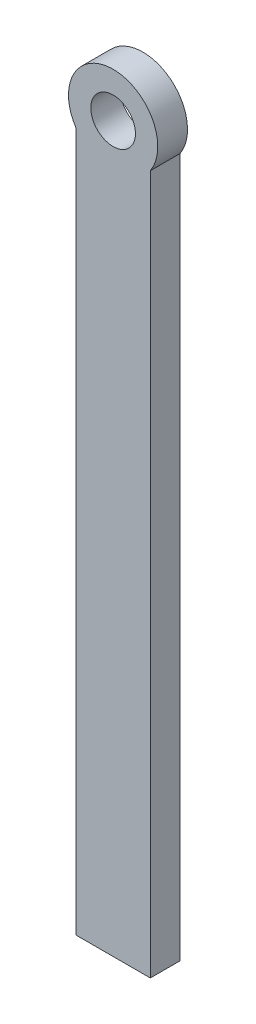
ISO-10303-21;
HEADER;
FILE_DESCRIPTION(('STEP AP214'),'2;1');
FILE_NAME('part.step','',(''),(''),'','','');
FILE_SCHEMA(('AUTOMOTIVE_DESIGN { 1 0 10303 214 1 1 1 1 }'));
ENDSEC;
DATA;
#1=APPLICATION_CONTEXT('core data for automotive mechanical design processes');
#2=APPLICATION_PROTOCOL_DEFINITION('international standard','automotive_design',2000,#1);
#3=PRODUCT_CONTEXT('',#1,'mechanical');
#4=PRODUCT('Part','Part','',(#3));
#5=PRODUCT_RELATED_PRODUCT_CATEGORY('part','',(#4));
#6=PRODUCT_DEFINITION_FORMATION('','',#4);
#7=PRODUCT_DEFINITION_CONTEXT('part definition',#1,'design');
#8=PRODUCT_DEFINITION('design','',#6,#7);
#9=PRODUCT_DEFINITION_SHAPE('','',#8);
#10=(LENGTH_UNIT() NAMED_UNIT(*) SI_UNIT(.MILLI.,.METRE.));
#11=(NAMED_UNIT(*) PLANE_ANGLE_UNIT() SI_UNIT($,.RADIAN.));
#12=(NAMED_UNIT(*) SI_UNIT($,.STERADIAN.) SOLID_ANGLE_UNIT());
#13=UNCERTAINTY_MEASURE_WITH_UNIT(LENGTH_MEASURE(1.E-05),#10,'distance_accuracy_value','');
#14=(GEOMETRIC_REPRESENTATION_CONTEXT(3) GLOBAL_UNCERTAINTY_ASSIGNED_CONTEXT((#13)) GLOBAL_UNIT_ASSIGNED_CONTEXT((#10,
#11,#12)) REPRESENTATION_CONTEXT('',''));
#15=CARTESIAN_POINT('',(0.,0.,0.));
#16=DIRECTION('',(0.,0.,1.));
#17=DIRECTION('',(1.,0.,0.));
#18=AXIS2_PLACEMENT_3D('',#15,#16,#17);
#19=CARTESIAN_POINT('',(0.,0.,20.));
#20=DIRECTION('',(0.,0.,-1.));
#21=DIRECTION('',(-1.,0.,0.));
#22=AXIS2_PLACEMENT_3D('',#19,#20,#21);
#23=PLANE('',#22);
#24=CARTESIAN_POINT('',(0.,0.,20.));
#25=DIRECTION('',(0.,0.,1.));
#26=DIRECTION('',(-1.,0.,0.));
#27=AXIS2_PLACEMENT_3D('',#24,#25,#26);
#28=CIRCLE('',#27,30.);
#29=CARTESIAN_POINT('',(24.9999999999999,-16.5831239517771,20.));
#30=VERTEX_POINT('',#29);
#31=CARTESIAN_POINT('',(-24.9999999999999,-16.5831239517771,20.));
#32=VERTEX_POINT('',#31);
#33=EDGE_CURVE('E96',#30,#32,#28,.T.);
#34=ORIENTED_EDGE('',*,*,#33,.T.);
#35=DIRECTION('',(0.,-1.,0.));
#36=VECTOR('',#35,1.);
#37=CARTESIAN_POINT('',(-24.9999999999999,-16.5831239517771,20.));
#38=LINE('',#37,#36);
#39=CARTESIAN_POINT('',(-24.9999999999999,-486.583123951777,20.));
#40=VERTEX_POINT('',#39);
#41=EDGE_CURVE('E91',#32,#40,#38,.T.);
#42=ORIENTED_EDGE('',*,*,#41,.T.);
#43=DIRECTION('',(1.,0.,0.));
#44=VECTOR('',#43,1.);
#45=CARTESIAN_POINT('',(-24.9999999999999,-486.583123951777,20.));
#46=LINE('',#45,#44);
#47=CARTESIAN_POINT('',(25.0000000000001,-486.583123951777,20.));
#48=VERTEX_POINT('',#47);
#49=EDGE_CURVE('E94',#40,#48,#46,.T.);
#50=ORIENTED_EDGE('',*,*,#49,.T.);
#51=DIRECTION('',(0.,1.,0.));
#52=VECTOR('',#51,1.);
#53=CARTESIAN_POINT('',(25.0000000000001,-486.583123951777,20.));
#54=LINE('',#53,#52);
#55=EDGE_CURVE('E61',#48,#30,#54,.T.);
#56=ORIENTED_EDGE('',*,*,#55,.T.);
#57=EDGE_LOOP('',(#34,#42,#50,#56));
#58=FACE_BOUND('',#57,.T.);
#59=CARTESIAN_POINT('',(0.,0.,20.));
#60=DIRECTION('',(0.,0.,1.));
#61=DIRECTION('',(1.,0.,0.));
#62=AXIS2_PLACEMENT_3D('',#59,#60,#61);
#63=CIRCLE('',#62,15.);
#64=CARTESIAN_POINT('',(15.,0.,20.));
#65=VERTEX_POINT('',#64);
#66=EDGE_CURVE('E116',#65,#65,#63,.T.);
#67=ORIENTED_EDGE('',*,*,#66,.F.);
#68=EDGE_LOOP('',(#67));
#69=FACE_BOUND('',#68,.T.);
#70=ADVANCED_FACE('F43',(#58,#69),#23,.F.);
#71=CARTESIAN_POINT('',(0.,0.,0.));
#72=DIRECTION('',(0.,0.,-1.));
#73=DIRECTION('',(-1.,0.,0.));
#74=AXIS2_PLACEMENT_3D('',#71,#72,#73);
#75=PLANE('',#74);
#76=CARTESIAN_POINT('',(0.,0.,0.));
#77=DIRECTION('',(0.,0.,1.));
#78=DIRECTION('',(-1.,0.,0.));
#79=AXIS2_PLACEMENT_3D('',#76,#77,#78);
#80=CIRCLE('',#79,30.);
#81=CARTESIAN_POINT('',(24.9999999999999,-16.5831239517771,0.));
#82=VERTEX_POINT('',#81);
#83=CARTESIAN_POINT('',(-24.9999999999999,-16.5831239517771,0.));
#84=VERTEX_POINT('',#83);
#85=EDGE_CURVE('E112',#82,#84,#80,.T.);
#86=ORIENTED_EDGE('',*,*,#85,.F.);
#87=DIRECTION('',(0.,1.,0.));
#88=VECTOR('',#87,1.);
#89=CARTESIAN_POINT('',(25.0000000000001,-486.583123951777,0.));
#90=LINE('',#89,#88);
#91=CARTESIAN_POINT('',(25.0000000000001,-486.583123951777,0.));
#92=VERTEX_POINT('',#91);
#93=EDGE_CURVE('E84',#92,#82,#90,.T.);
#94=ORIENTED_EDGE('',*,*,#93,.F.);
#95=DIRECTION('',(1.,0.,0.));
#96=VECTOR('',#95,1.);
#97=CARTESIAN_POINT('',(-24.9999999999999,-486.583123951777,0.));
#98=LINE('',#97,#96);
#99=CARTESIAN_POINT('',(-24.9999999999999,-486.583123951777,0.));
#100=VERTEX_POINT('',#99);
#101=EDGE_CURVE('E78',#100,#92,#98,.T.);
#102=ORIENTED_EDGE('',*,*,#101,.F.);
#103=DIRECTION('',(0.,-1.,0.));
#104=VECTOR('',#103,1.);
#105=CARTESIAN_POINT('',(-24.9999999999999,-16.5831239517771,0.));
#106=LINE('',#105,#104);
#107=EDGE_CURVE('E101',#84,#100,#106,.T.);
#108=ORIENTED_EDGE('',*,*,#107,.F.);
#109=EDGE_LOOP('',(#86,#94,#102,#108));
#110=FACE_BOUND('',#109,.T.);
#111=CARTESIAN_POINT('',(0.,0.,0.));
#112=DIRECTION('',(0.,0.,1.));
#113=DIRECTION('',(1.,0.,0.));
#114=AXIS2_PLACEMENT_3D('',#111,#112,#113);
#115=CIRCLE('',#114,15.);
#116=CARTESIAN_POINT('',(15.,0.,0.));
#117=VERTEX_POINT('',#116);
#118=EDGE_CURVE('E134',#117,#117,#115,.T.);
#119=ORIENTED_EDGE('',*,*,#118,.T.);
#120=EDGE_LOOP('',(#119));
#121=FACE_BOUND('',#120,.T.);
#122=ADVANCED_FACE('F129',(#110,#121),#75,.T.);
#123=CARTESIAN_POINT('',(0.,0.,20.));
#124=DIRECTION('',(0.,0.,-1.));
#125=DIRECTION('',(-1.,0.,0.));
#126=AXIS2_PLACEMENT_3D('',#123,#124,#125);
#127=CYLINDRICAL_SURFACE('',#126,30.);
#128=ORIENTED_EDGE('',*,*,#85,.T.);
#129=DIRECTION('',(0.,0.,-1.));
#130=VECTOR('',#129,1.);
#131=CARTESIAN_POINT('',(-24.9999999999999,-16.5831239517771,20.));
#132=LINE('',#131,#130);
#133=EDGE_CURVE('E11',#32,#84,#132,.T.);
#134=ORIENTED_EDGE('',*,*,#133,.F.);
#135=ORIENTED_EDGE('',*,*,#33,.F.);
#136=DIRECTION('',(0.,0.,-1.));
#137=VECTOR('',#136,1.);
#138=CARTESIAN_POINT('',(24.9999999999999,-16.5831239517771,20.));
#139=LINE('',#138,#137);
#140=EDGE_CURVE('E108',#30,#82,#139,.T.);
#141=ORIENTED_EDGE('',*,*,#140,.T.);
#142=EDGE_LOOP('',(#128,#134,#135,#141));
#143=FACE_BOUND('',#142,.T.);
#144=ADVANCED_FACE('F45',(#143),#127,.T.);
#145=CARTESIAN_POINT('',(-24.9999999999999,-16.5831239517771,20.));
#146=DIRECTION('',(1.,0.,0.));
#147=DIRECTION('',(0.,0.,-1.));
#148=AXIS2_PLACEMENT_3D('',#145,#146,#147);
#149=PLANE('',#148);
#150=ORIENTED_EDGE('',*,*,#107,.T.);
#151=DIRECTION('',(0.,0.,-1.));
#152=VECTOR('',#151,1.);
#153=CARTESIAN_POINT('',(-24.9999999999999,-486.583123951777,20.));
#154=LINE('',#153,#152);
#155=EDGE_CURVE('E53',#40,#100,#154,.T.);
#156=ORIENTED_EDGE('',*,*,#155,.F.);
#157=ORIENTED_EDGE('',*,*,#41,.F.);
#158=ORIENTED_EDGE('',*,*,#133,.T.);
#159=EDGE_LOOP('',(#150,#156,#157,#158));
#160=FACE_BOUND('',#159,.T.);
#161=ADVANCED_FACE('F100',(#160),#149,.F.);
#162=CARTESIAN_POINT('',(-24.9999999999999,-486.583123951777,20.));
#163=DIRECTION('',(0.,1.,0.));
#164=DIRECTION('',(0.,0.,1.));
#165=AXIS2_PLACEMENT_3D('',#162,#163,#164);
#166=PLANE('',#165);
#167=ORIENTED_EDGE('',*,*,#101,.T.);
#168=DIRECTION('',(0.,0.,-1.));
#169=VECTOR('',#168,1.);
#170=CARTESIAN_POINT('',(25.0000000000001,-486.583123951777,20.));
#171=LINE('',#170,#169);
#172=EDGE_CURVE('E103',#48,#92,#171,.T.);
#173=ORIENTED_EDGE('',*,*,#172,.F.);
#174=ORIENTED_EDGE('',*,*,#49,.F.);
#175=ORIENTED_EDGE('',*,*,#155,.T.);
#176=EDGE_LOOP('',(#167,#173,#174,#175));
#177=FACE_BOUND('',#176,.T.);
#178=ADVANCED_FACE('F104',(#177),#166,.F.);
#179=CARTESIAN_POINT('',(25.0000000000001,-486.583123951777,20.));
#180=DIRECTION('',(-1.,0.,0.));
#181=DIRECTION('',(0.,-1.,0.));
#182=AXIS2_PLACEMENT_3D('',#179,#180,#181);
#183=PLANE('',#182);
#184=ORIENTED_EDGE('',*,*,#93,.T.);
#185=ORIENTED_EDGE('',*,*,#140,.F.);
#186=ORIENTED_EDGE('',*,*,#55,.F.);
#187=ORIENTED_EDGE('',*,*,#172,.T.);
#188=EDGE_LOOP('',(#184,#185,#186,#187));
#189=FACE_BOUND('',#188,.T.);
#190=ADVANCED_FACE('F126',(#189),#183,.F.);
#191=CARTESIAN_POINT('',(0.,0.,20.));
#192=DIRECTION('',(0.,0.,-1.));
#193=DIRECTION('',(-1.,0.,0.));
#194=AXIS2_PLACEMENT_3D('',#191,#192,#193);
#195=CYLINDRICAL_SURFACE('',#194,15.);
#196=ORIENTED_EDGE('',*,*,#66,.T.);
#197=EDGE_LOOP('',(#196));
#198=FACE_BOUND('',#197,.T.);
#199=ORIENTED_EDGE('',*,*,#118,.F.);
#200=EDGE_LOOP('',(#199));
#201=FACE_BOUND('',#200,.T.);
#202=ADVANCED_FACE('F142',(#198,#201),#195,.F.);
#203=CLOSED_SHELL('',(#70,#122,#144,#161,#178,#190,#202));
#204=MANIFOLD_SOLID_BREP('B2',#203);
#205=ADVANCED_BREP_SHAPE_REPRESENTATION('',(#18,#204),#14);
#206=SHAPE_DEFINITION_REPRESENTATION(#9,#205);
ENDSEC;
END-ISO-10303-21;
